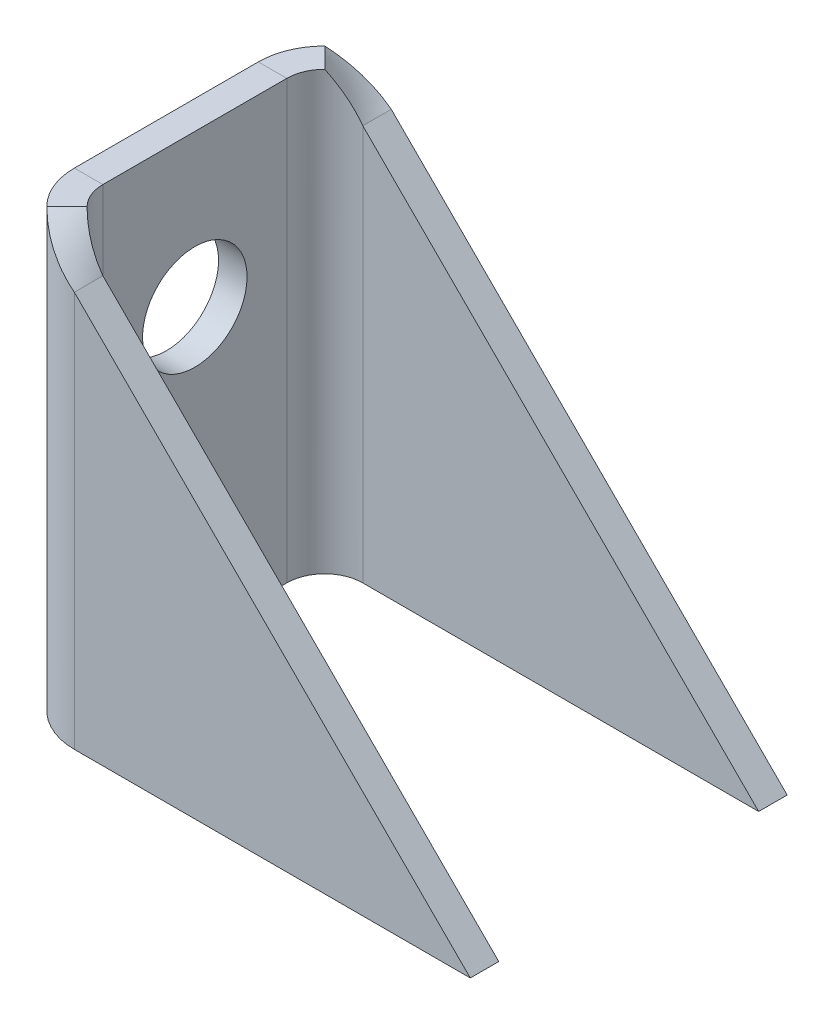
ISO-10303-21;
HEADER;
FILE_DESCRIPTION(('STEP AP214'),'2;1');
FILE_NAME('part.step','',(''),(''),'','','');
FILE_SCHEMA(('AUTOMOTIVE_DESIGN { 1 0 10303 214 1 1 1 1 }'));
ENDSEC;
DATA;
#1=APPLICATION_CONTEXT('core data for automotive mechanical design processes');
#2=APPLICATION_PROTOCOL_DEFINITION('international standard','automotive_design',2000,#1);
#3=PRODUCT_CONTEXT('',#1,'mechanical');
#4=PRODUCT('Part','Part','',(#3));
#5=PRODUCT_RELATED_PRODUCT_CATEGORY('part','',(#4));
#6=PRODUCT_DEFINITION_FORMATION('','',#4);
#7=PRODUCT_DEFINITION_CONTEXT('part definition',#1,'design');
#8=PRODUCT_DEFINITION('design','',#6,#7);
#9=PRODUCT_DEFINITION_SHAPE('','',#8);
#10=(LENGTH_UNIT() NAMED_UNIT(*) SI_UNIT(.MILLI.,.METRE.));
#11=(NAMED_UNIT(*) PLANE_ANGLE_UNIT() SI_UNIT($,.RADIAN.));
#12=(NAMED_UNIT(*) SI_UNIT($,.STERADIAN.) SOLID_ANGLE_UNIT());
#13=UNCERTAINTY_MEASURE_WITH_UNIT(LENGTH_MEASURE(1.E-05),#10,'distance_accuracy_value','');
#14=(GEOMETRIC_REPRESENTATION_CONTEXT(3) GLOBAL_UNCERTAINTY_ASSIGNED_CONTEXT((#13)) GLOBAL_UNIT_ASSIGNED_CONTEXT((#10,
#11,#12)) REPRESENTATION_CONTEXT('',''));
#15=CARTESIAN_POINT('',(0.,0.,0.));
#16=DIRECTION('',(0.,0.,1.));
#17=DIRECTION('',(1.,0.,0.));
#18=AXIS2_PLACEMENT_3D('',#15,#16,#17);
#19=CARTESIAN_POINT('',(37.1598449493429,23.,38.3401550506568));
#20=DIRECTION('',(0.,-1.,0.));
#21=DIRECTION('',(0.,0.,1.));
#22=AXIS2_PLACEMENT_3D('',#19,#20,#21);
#23=PLANE('',#22);
#24=DIRECTION('',(0.,0.,1.));
#25=VECTOR('',#24,1.);
#26=CARTESIAN_POINT('',(37.1598449493429,23.,38.3401550506568));
#27=LINE('',#26,#25);
#28=CARTESIAN_POINT('',(37.1598449493427,23.,3.50000000000001));
#29=VERTEX_POINT('',#28);
#30=CARTESIAN_POINT('',(37.1598449493428,23.,13.1803101013139));
#31=VERTEX_POINT('',#30);
#32=EDGE_CURVE('E61',#29,#31,#27,.T.);
#33=ORIENTED_EDGE('',*,*,#32,.F.);
#34=DIRECTION('',(-1.,0.,0.));
#35=VECTOR('',#34,1.);
#36=CARTESIAN_POINT('',(37.1598449493427,23.,3.50000000000001));
#37=LINE('',#36,#35);
#38=CARTESIAN_POINT('',(35.6598449493427,23.,3.50000000000002));
#39=VERTEX_POINT('',#38);
#40=EDGE_CURVE('E12',#29,#39,#37,.T.);
#41=ORIENTED_EDGE('',*,*,#40,.T.);
#42=DIRECTION('',(0.,0.,1.));
#43=VECTOR('',#42,1.);
#44=CARTESIAN_POINT('',(35.6598449493428,23.,38.3401550506568));
#45=LINE('',#44,#43);
#46=CARTESIAN_POINT('',(35.6598449493428,23.,13.1803101013139));
#47=VERTEX_POINT('',#46);
#48=EDGE_CURVE('E74',#39,#47,#45,.T.);
#49=ORIENTED_EDGE('',*,*,#48,.T.);
#50=DIRECTION('',(-1.,0.,0.));
#51=VECTOR('',#50,1.);
#52=CARTESIAN_POINT('',(37.1598449493428,23.,13.1803101013139));
#53=LINE('',#52,#51);
#54=EDGE_CURVE('E336',#31,#47,#53,.T.);
#55=ORIENTED_EDGE('',*,*,#54,.F.);
#56=EDGE_LOOP('',(#33,#41,#49,#55));
#57=FACE_BOUND('',#56,.T.);
#58=ADVANCED_FACE('F58',(#57),#23,.F.);
#59=CARTESIAN_POINT('',(37.1598449493429,0.,38.3401550506568));
#60=DIRECTION('',(0.,1.,0.));
#61=DIRECTION('',(0.,0.,-1.));
#62=AXIS2_PLACEMENT_3D('',#59,#60,#61);
#63=PLANE('',#62);
#64=DIRECTION('',(0.,0.,1.));
#65=VECTOR('',#64,1.);
#66=CARTESIAN_POINT('',(35.6598449493428,0.,38.3401550506568));
#67=LINE('',#66,#65);
#68=CARTESIAN_POINT('',(35.6598449493428,0.,13.1803101013139));
#69=VERTEX_POINT('',#68);
#70=CARTESIAN_POINT('',(35.6598449493427,0.,3.50000000000002));
#71=VERTEX_POINT('',#70);
#72=EDGE_CURVE('E81',#69,#71,#67,.F.);
#73=ORIENTED_EDGE('',*,*,#72,.T.);
#74=DIRECTION('',(1.,0.,0.));
#75=VECTOR('',#74,1.);
#76=CARTESIAN_POINT('',(37.1598449493427,0.,3.50000000000001));
#77=LINE('',#76,#75);
#78=CARTESIAN_POINT('',(37.1598449493427,0.,3.50000000000001));
#79=VERTEX_POINT('',#78);
#80=EDGE_CURVE('E310',#71,#79,#77,.T.);
#81=ORIENTED_EDGE('',*,*,#80,.T.);
#82=DIRECTION('',(0.,0.,-1.));
#83=VECTOR('',#82,1.);
#84=CARTESIAN_POINT('',(37.1598449493429,0.,38.3401550506568));
#85=LINE('',#84,#83);
#86=CARTESIAN_POINT('',(37.1598449493428,0.,13.1803101013139));
#87=VERTEX_POINT('',#86);
#88=EDGE_CURVE('E317',#87,#79,#85,.T.);
#89=ORIENTED_EDGE('',*,*,#88,.F.);
#90=DIRECTION('',(1.,0.,0.));
#91=VECTOR('',#90,1.);
#92=CARTESIAN_POINT('',(37.1598449493428,0.,13.1803101013139));
#93=LINE('',#92,#91);
#94=EDGE_CURVE('E311',#69,#87,#93,.T.);
#95=ORIENTED_EDGE('',*,*,#94,.F.);
#96=EDGE_LOOP('',(#73,#81,#89,#95));
#97=FACE_BOUND('',#96,.T.);
#98=ADVANCED_FACE('F477',(#97),#63,.F.);
#99=CARTESIAN_POINT('',(35.6598449493428,0.,38.3401550506568));
#100=DIRECTION('',(-1.,0.,0.));
#101=DIRECTION('',(0.,0.,1.));
#102=AXIS2_PLACEMENT_3D('',#99,#100,#101);
#103=PLANE('',#102);
#104=CARTESIAN_POINT('',(35.6598449493427,15.,8.34015505065677));
#105=DIRECTION('',(1.,0.,0.));
#106=DIRECTION('',(0.,0.,-1.));
#107=AXIS2_PLACEMENT_3D('',#104,#105,#106);
#108=CIRCLE('',#107,2.74999999999999);
#109=CARTESIAN_POINT('',(35.6598449493427,15.,5.59015505065678));
#110=VERTEX_POINT('',#109);
#111=EDGE_CURVE('E316',#110,#110,#108,.T.);
#112=ORIENTED_EDGE('',*,*,#111,.T.);
#113=EDGE_LOOP('',(#112));
#114=FACE_BOUND('',#113,.T.);
#115=ORIENTED_EDGE('',*,*,#48,.F.);
#116=DIRECTION('',(0.,-1.,0.));
#117=VECTOR('',#116,1.);
#118=CARTESIAN_POINT('',(35.6598449493427,0.,3.50000000000002));
#119=LINE('',#118,#117);
#120=EDGE_CURVE('E66',#39,#71,#119,.T.);
#121=ORIENTED_EDGE('',*,*,#120,.T.);
#122=ORIENTED_EDGE('',*,*,#72,.F.);
#123=DIRECTION('',(0.,-1.,0.));
#124=VECTOR('',#123,1.);
#125=CARTESIAN_POINT('',(35.6598449493428,0.,13.1803101013139));
#126=LINE('',#125,#124);
#127=EDGE_CURVE('E339',#47,#69,#126,.T.);
#128=ORIENTED_EDGE('',*,*,#127,.F.);
#129=EDGE_LOOP('',(#115,#121,#122,#128));
#130=FACE_BOUND('',#129,.T.);
#131=ADVANCED_FACE('F478',(#114,#130),#103,.T.);
#132=CARTESIAN_POINT('',(37.1598449493429,0.,38.3401550506568));
#133=DIRECTION('',(-1.,0.,0.));
#134=DIRECTION('',(0.,0.,1.));
#135=AXIS2_PLACEMENT_3D('',#132,#133,#134);
#136=PLANE('',#135);
#137=DIRECTION('',(0.,-1.,0.));
#138=VECTOR('',#137,1.);
#139=CARTESIAN_POINT('',(37.1598449493427,0.,3.50000000000001));
#140=LINE('',#139,#138);
#141=EDGE_CURVE('E308',#29,#79,#140,.T.);
#142=ORIENTED_EDGE('',*,*,#141,.F.);
#143=ORIENTED_EDGE('',*,*,#32,.T.);
#144=DIRECTION('',(0.,-1.,0.));
#145=VECTOR('',#144,1.);
#146=CARTESIAN_POINT('',(37.1598449493428,0.,13.1803101013139));
#147=LINE('',#146,#145);
#148=EDGE_CURVE('E321',#31,#87,#147,.T.);
#149=ORIENTED_EDGE('',*,*,#148,.T.);
#150=ORIENTED_EDGE('',*,*,#88,.T.);
#151=EDGE_LOOP('',(#142,#143,#149,#150));
#152=FACE_BOUND('',#151,.T.);
#153=CARTESIAN_POINT('',(37.1598449493427,15.,8.34015505065677));
#154=DIRECTION('',(1.,0.,0.));
#155=DIRECTION('',(0.,0.,-1.));
#156=AXIS2_PLACEMENT_3D('',#153,#154,#155);
#157=CIRCLE('',#156,2.74999999999999);
#158=CARTESIAN_POINT('',(37.1598449493427,15.,5.59015505065678));
#159=VERTEX_POINT('',#158);
#160=EDGE_CURVE('E315',#159,#159,#157,.T.);
#161=ORIENTED_EDGE('',*,*,#160,.F.);
#162=EDGE_LOOP('',(#161));
#163=FACE_BOUND('',#162,.T.);
#164=ADVANCED_FACE('F473',(#152,#163),#136,.F.);
#165=CARTESIAN_POINT('',(37.1598449493427,15.,8.34015505065677));
#166=DIRECTION('',(1.,0.,0.));
#167=DIRECTION('',(0.,0.,-1.));
#168=AXIS2_PLACEMENT_3D('',#165,#166,#167);
#169=CYLINDRICAL_SURFACE('',#168,2.74999999999999);
#170=ORIENTED_EDGE('',*,*,#160,.T.);
#171=EDGE_LOOP('',(#170));
#172=FACE_BOUND('',#171,.T.);
#173=ORIENTED_EDGE('',*,*,#111,.F.);
#174=EDGE_LOOP('',(#173));
#175=FACE_BOUND('',#174,.T.);
#176=ADVANCED_FACE('F431',(#172,#175),#169,.F.);
#177=CARTESIAN_POINT('',(36.6849712151899,23.,15.6551838354668));
#178=CARTESIAN_POINT('',(37.0089675436019,22.6399857128719,15.9791801638789));
#179=CARTESIAN_POINT('',(37.3971785180446,22.2800516835523,16.2385624605538));
#180=CARTESIAN_POINT('',(38.2437273540853,21.5601033671047,16.589214469653));
#181=CARTESIAN_POINT('',(38.7016449475433,21.2001693377851,16.6803101013139));
#182=CARTESIAN_POINT('',(39.1598449493428,20.840155050657,16.6803101013139));
#183=CARTESIAN_POINT('',(37.7456313869697,23.,14.594523663687));
#184=CARTESIAN_POINT('',(37.9307630559111,22.6400033890676,14.7796553326284));
#185=CARTESIAN_POINT('',(38.152606988601,22.2800516835523,14.9278828780224));
#186=CARTESIAN_POINT('',(38.6363491806242,21.5601033671047,15.1282554546505));
#187=CARTESIAN_POINT('',(38.8980292323011,21.2001516615893,15.1803101013139));
#188=CARTESIAN_POINT('',(39.1598449493428,20.840155050657,15.1803101013139));
#189=B_SPLINE_SURFACE_WITH_KNOTS('',1,3,((#177,#178,#179,#180,#181,#182),(#183,#184,#185,#186,
#187,#188)),.UNSPECIFIED.,.F.,.F.,.F.,(2,2),(4,2,4),(0.,1.),(0.,0.5,1.),.UNSPECIFIED.);
#190=CARTESIAN_POINT('',(37.7456313869697,23.,14.594523663687));
#191=CARTESIAN_POINT('',(36.6849712151899,23.,15.6551838354668));
#192=B_SPLINE_CURVE_WITH_KNOTS('',1,(#190,#191),.UNSPECIFIED.,.F.,.F.,(2,2),(0.,1.),.UNSPECIFIED.);
#193=CARTESIAN_POINT('',(36.6849712151899,23.,15.6551838354668));
#194=VERTEX_POINT('',#193);
#195=CARTESIAN_POINT('',(37.7456313869697,23.,14.594523663687));
#196=VERTEX_POINT('',#195);
#197=EDGE_CURVE('E334',#194,#196,#192,.F.);
#198=CARTESIAN_POINT('',(36.6849712151899,23.,15.6551838354668));
#199=CARTESIAN_POINT('',(37.0089675436019,22.6399857128719,15.9791801638789));
#200=CARTESIAN_POINT('',(37.3971785180446,22.2800516835523,16.2385624605538));
#201=CARTESIAN_POINT('',(38.2437273540853,21.5601033671047,16.589214469653));
#202=CARTESIAN_POINT('',(38.7016449475433,21.2001693377851,16.6803101013139));
#203=CARTESIAN_POINT('',(39.1598449493428,20.840155050657,16.6803101013139));
#204=B_SPLINE_CURVE_WITH_KNOTS('',3,(#198,#199,#200,#201,#202,#203),.UNSPECIFIED.,.F.,.F.,(4,2,
4),(0.,0.5,1.),.UNSPECIFIED.);
#205=CARTESIAN_POINT('',(39.1598449493428,20.840155050657,16.6803101013139));
#206=VERTEX_POINT('',#205);
#207=EDGE_CURVE('E371',#194,#206,#204,.T.);
#208=CARTESIAN_POINT('',(39.1598449493428,20.840155050657,16.6803101013139));
#209=CARTESIAN_POINT('',(39.1598449493428,20.840155050657,15.1803101013139));
#210=B_SPLINE_CURVE_WITH_KNOTS('',1,(#208,#209),.UNSPECIFIED.,.F.,.F.,(2,2),(0.,1.),.UNSPECIFIED.);
#211=CARTESIAN_POINT('',(39.1598449493428,20.840155050657,15.1803101013139));
#212=VERTEX_POINT('',#211);
#213=EDGE_CURVE('E352',#212,#206,#210,.F.);
#214=CARTESIAN_POINT('',(39.1598449493428,20.840155050657,15.1803101013139));
#215=CARTESIAN_POINT('',(38.8980292323011,21.2001516615893,15.1803101013139));
#216=CARTESIAN_POINT('',(38.6363491806242,21.5601033671047,15.1282554546505));
#217=CARTESIAN_POINT('',(38.152606988601,22.2800516835523,14.9278828780224));
#218=CARTESIAN_POINT('',(37.9307630559111,22.6400033890676,14.7796553326284));
#219=CARTESIAN_POINT('',(37.7456313869697,23.,14.594523663687));
#220=B_SPLINE_CURVE_WITH_KNOTS('',3,(#214,#215,#216,#217,#218,#219),.UNSPECIFIED.,.F.,.F.,(4,2,
4),(0.,0.5,1.),.UNSPECIFIED.);
#221=EDGE_CURVE('E366',#196,#212,#220,.F.);
#222=ORIENTED_EDGE('',*,*,#197,.F.);
#223=ORIENTED_EDGE('',*,*,#207,.T.);
#224=ORIENTED_EDGE('',*,*,#213,.F.);
#225=ORIENTED_EDGE('',*,*,#221,.F.);
#226=EDGE_LOOP('',(#222,#223,#224,#225));
#227=FACE_BOUND('',#226,.T.);
#228=ADVANCED_FACE('F420',(#227),#189,.F.);
#229=CARTESIAN_POINT('',(39.1598449493428,0.,13.1803101013139));
#230=DIRECTION('',(0.,1.,0.));
#231=DIRECTION('',(0.,0.,1.));
#232=AXIS2_PLACEMENT_3D('',#229,#230,#231);
#233=PLANE('',#232);
#234=DIRECTION('',(0.,0.,-1.));
#235=VECTOR('',#234,1.);
#236=CARTESIAN_POINT('',(39.1598449493428,0.,15.1803101013139));
#237=LINE('',#236,#235);
#238=CARTESIAN_POINT('',(39.1598449493428,0.,16.6803101013139));
#239=VERTEX_POINT('',#238);
#240=CARTESIAN_POINT('',(39.1598449493428,0.,15.1803101013138));
#241=VERTEX_POINT('',#240);
#242=EDGE_CURVE('E467',#239,#241,#237,.T.);
#243=ORIENTED_EDGE('',*,*,#242,.F.);
#244=CARTESIAN_POINT('',(39.1598449493428,0.,13.1803101013139));
#245=DIRECTION('',(0.,-1.,0.));
#246=DIRECTION('',(0.,0.,-1.));
#247=AXIS2_PLACEMENT_3D('',#244,#245,#246);
#248=CIRCLE('',#247,3.5);
#249=EDGE_CURVE('E367',#239,#69,#248,.T.);
#250=ORIENTED_EDGE('',*,*,#249,.T.);
#251=ORIENTED_EDGE('',*,*,#94,.T.);
#252=CARTESIAN_POINT('',(39.1598449493428,0.,13.1803101013139));
#253=DIRECTION('',(0.,-1.,0.));
#254=DIRECTION('',(0.,0.,-1.));
#255=AXIS2_PLACEMENT_3D('',#252,#253,#254);
#256=CIRCLE('',#255,2.);
#257=EDGE_CURVE('E362',#241,#87,#256,.T.);
#258=ORIENTED_EDGE('',*,*,#257,.F.);
#259=EDGE_LOOP('',(#243,#250,#251,#258));
#260=FACE_BOUND('',#259,.T.);
#261=ADVANCED_FACE('F394',(#260),#233,.F.);
#262=CARTESIAN_POINT('',(39.1598449493428,23.,13.1803101013139));
#263=DIRECTION('',(0.,-1.,0.));
#264=DIRECTION('',(-1.,0.,0.));
#265=AXIS2_PLACEMENT_3D('',#262,#263,#264);
#266=PLANE('',#265);
#267=CARTESIAN_POINT('',(39.1598449493428,23.,13.1803101013139));
#268=DIRECTION('',(0.,-1.,0.));
#269=DIRECTION('',(0.,0.,-1.));
#270=AXIS2_PLACEMENT_3D('',#267,#268,#269);
#271=CIRCLE('',#270,3.5);
#272=EDGE_CURVE('E370',#47,#194,#271,.F.);
#273=ORIENTED_EDGE('',*,*,#272,.T.);
#274=ORIENTED_EDGE('',*,*,#197,.T.);
#275=CARTESIAN_POINT('',(39.1598449493428,23.,13.1803101013139));
#276=DIRECTION('',(0.,1.,0.));
#277=DIRECTION('',(1.,0.,0.));
#278=AXIS2_PLACEMENT_3D('',#275,#276,#277);
#279=CIRCLE('',#278,2.);
#280=EDGE_CURVE('E365',#31,#196,#279,.T.);
#281=ORIENTED_EDGE('',*,*,#280,.F.);
#282=ORIENTED_EDGE('',*,*,#54,.T.);
#283=EDGE_LOOP('',(#273,#274,#281,#282));
#284=FACE_BOUND('',#283,.T.);
#285=ADVANCED_FACE('F387',(#284),#266,.F.);
#286=CARTESIAN_POINT('',(39.1598449493428,34.9501539615587,13.1803101013139));
#287=DIRECTION('',(0.,-1.,0.));
#288=DIRECTION('',(0.,0.,-1.));
#289=AXIS2_PLACEMENT_3D('',#286,#287,#288);
#290=CYLINDRICAL_SURFACE('',#289,2.);
#291=ORIENTED_EDGE('',*,*,#148,.F.);
#292=ORIENTED_EDGE('',*,*,#280,.T.);
#293=ORIENTED_EDGE('',*,*,#221,.T.);
#294=DIRECTION('',(0.,-1.,0.));
#295=VECTOR('',#294,1.);
#296=CARTESIAN_POINT('',(39.1598449493428,0.,15.1803101013139));
#297=LINE('',#296,#295);
#298=EDGE_CURVE('E344',#212,#241,#297,.T.);
#299=ORIENTED_EDGE('',*,*,#298,.T.);
#300=ORIENTED_EDGE('',*,*,#257,.T.);
#301=EDGE_LOOP('',(#291,#292,#293,#299,#300));
#302=FACE_BOUND('',#301,.T.);
#303=ADVANCED_FACE('F378',(#302),#290,.F.);
#304=CARTESIAN_POINT('',(39.1598449493428,34.9501539615587,13.1803101013139));
#305=DIRECTION('',(0.,-1.,0.));
#306=DIRECTION('',(0.,0.,-1.));
#307=AXIS2_PLACEMENT_3D('',#304,#305,#306);
#308=CYLINDRICAL_SURFACE('',#307,3.5);
#309=ORIENTED_EDGE('',*,*,#127,.T.);
#310=ORIENTED_EDGE('',*,*,#249,.F.);
#311=DIRECTION('',(0.,-1.,0.));
#312=VECTOR('',#311,1.);
#313=CARTESIAN_POINT('',(39.1598449493428,0.,16.6803101013139));
#314=LINE('',#313,#312);
#315=EDGE_CURVE('E292',#206,#239,#314,.T.);
#316=ORIENTED_EDGE('',*,*,#315,.F.);
#317=ORIENTED_EDGE('',*,*,#207,.F.);
#318=ORIENTED_EDGE('',*,*,#272,.F.);
#319=EDGE_LOOP('',(#309,#310,#316,#317,#318));
#320=FACE_BOUND('',#319,.T.);
#321=ADVANCED_FACE('F277',(#320),#308,.T.);
#322=CARTESIAN_POINT('',(59.9999999999997,0.,15.1803101013137));
#323=DIRECTION('',(0.,0.,1.));
#324=DIRECTION('',(1.,0.,0.));
#325=AXIS2_PLACEMENT_3D('',#322,#323,#324);
#326=PLANE('',#325);
#327=ORIENTED_EDGE('',*,*,#298,.F.);
#328=DIRECTION('',(-0.707106781186546,0.707106781186549,0.));
#329=VECTOR('',#328,1.);
#330=CARTESIAN_POINT('',(59.9999999999997,0.,15.1803101013137));
#331=LINE('',#330,#329);
#332=CARTESIAN_POINT('',(59.9999999999997,0.,15.1803101013137));
#333=VERTEX_POINT('',#332);
#334=EDGE_CURVE('E350',#333,#212,#331,.T.);
#335=ORIENTED_EDGE('',*,*,#334,.F.);
#336=DIRECTION('',(-1.,0.,0.));
#337=VECTOR('',#336,1.);
#338=CARTESIAN_POINT('',(59.9999999999997,0.,15.1803101013137));
#339=LINE('',#338,#337);
#340=EDGE_CURVE('E347',#333,#241,#339,.T.);
#341=ORIENTED_EDGE('',*,*,#340,.T.);
#342=EDGE_LOOP('',(#327,#335,#341));
#343=FACE_BOUND('',#342,.T.);
#344=ADVANCED_FACE('F273',(#343),#326,.F.);
#345=CARTESIAN_POINT('',(59.9999999999997,0.,15.1803101013137));
#346=DIRECTION('',(0.707106781186549,0.707106781186546,0.));
#347=DIRECTION('',(-0.707106781186546,0.707106781186549,0.));
#348=AXIS2_PLACEMENT_3D('',#345,#346,#347);
#349=PLANE('',#348);
#350=ORIENTED_EDGE('',*,*,#334,.T.);
#351=ORIENTED_EDGE('',*,*,#213,.T.);
#352=DIRECTION('',(-0.707106781186546,0.707106781186549,0.));
#353=VECTOR('',#352,1.);
#354=CARTESIAN_POINT('',(59.9999999999997,0.,16.6803101013137));
#355=LINE('',#354,#353);
#356=CARTESIAN_POINT('',(59.9999999999997,0.,16.6803101013137));
#357=VERTEX_POINT('',#356);
#358=EDGE_CURVE('E301',#357,#206,#355,.T.);
#359=ORIENTED_EDGE('',*,*,#358,.F.);
#360=DIRECTION('',(0.,0.,-1.));
#361=VECTOR('',#360,1.);
#362=CARTESIAN_POINT('',(59.9999999999997,0.,15.1803101013137));
#363=LINE('',#362,#361);
#364=EDGE_CURVE('E305',#357,#333,#363,.T.);
#365=ORIENTED_EDGE('',*,*,#364,.T.);
#366=EDGE_LOOP('',(#350,#351,#359,#365));
#367=FACE_BOUND('',#366,.T.);
#368=ADVANCED_FACE('F276',(#367),#349,.T.);
#369=CARTESIAN_POINT('',(59.9999999999997,0.,16.6803101013137));
#370=DIRECTION('',(0.,0.,1.));
#371=DIRECTION('',(1.,0.,0.));
#372=AXIS2_PLACEMENT_3D('',#369,#370,#371);
#373=PLANE('',#372);
#374=ORIENTED_EDGE('',*,*,#358,.T.);
#375=ORIENTED_EDGE('',*,*,#315,.T.);
#376=DIRECTION('',(1.,0.,0.));
#377=VECTOR('',#376,1.);
#378=CARTESIAN_POINT('',(59.9999999999997,0.,16.6803101013137));
#379=LINE('',#378,#377);
#380=EDGE_CURVE('E300',#357,#239,#379,.F.);
#381=ORIENTED_EDGE('',*,*,#380,.F.);
#382=EDGE_LOOP('',(#374,#375,#381));
#383=FACE_BOUND('',#382,.T.);
#384=ADVANCED_FACE('F282',(#383),#373,.T.);
#385=CARTESIAN_POINT('',(59.9999999999997,0.,15.1803101013137));
#386=DIRECTION('',(0.,1.,0.));
#387=DIRECTION('',(-1.,0.,0.));
#388=AXIS2_PLACEMENT_3D('',#385,#386,#387);
#389=PLANE('',#388);
#390=ORIENTED_EDGE('',*,*,#380,.T.);
#391=ORIENTED_EDGE('',*,*,#242,.T.);
#392=ORIENTED_EDGE('',*,*,#340,.F.);
#393=ORIENTED_EDGE('',*,*,#364,.F.);
#394=EDGE_LOOP('',(#390,#391,#392,#393));
#395=FACE_BOUND('',#394,.T.);
#396=ADVANCED_FACE('F389',(#395),#389,.F.);
#397=CARTESIAN_POINT('',(0.,0.,1.5));
#398=DIRECTION('',(0.,0.,-1.));
#399=DIRECTION('',(-1.,0.,0.));
#400=AXIS2_PLACEMENT_3D('',#397,#398,#399);
#401=PLANE('',#400);
#402=DIRECTION('',(0.707106781186552,-0.707106781186544,0.));
#403=VECTOR('',#402,1.);
#404=CARTESIAN_POINT('',(60.,0.,1.5));
#405=LINE('',#404,#403);
#406=CARTESIAN_POINT('',(39.1598449493427,20.840155050657,1.5));
#407=VERTEX_POINT('',#406);
#408=CARTESIAN_POINT('',(60.,0.,1.5));
#409=VERTEX_POINT('',#408);
#410=EDGE_CURVE('E249',#407,#409,#405,.T.);
#411=ORIENTED_EDGE('',*,*,#410,.F.);
#412=DIRECTION('',(0.,-1.,0.));
#413=VECTOR('',#412,1.);
#414=CARTESIAN_POINT('',(39.1598449493427,0.,1.5));
#415=LINE('',#414,#413);
#416=CARTESIAN_POINT('',(39.1598449493427,0.,1.5));
#417=VERTEX_POINT('',#416);
#418=EDGE_CURVE('E178',#407,#417,#415,.T.);
#419=ORIENTED_EDGE('',*,*,#418,.T.);
#420=DIRECTION('',(1.,0.,0.));
#421=VECTOR('',#420,1.);
#422=CARTESIAN_POINT('',(0.,0.,1.5));
#423=LINE('',#422,#421);
#424=EDGE_CURVE('E241',#417,#409,#423,.T.);
#425=ORIENTED_EDGE('',*,*,#424,.T.);
#426=EDGE_LOOP('',(#411,#419,#425));
#427=FACE_BOUND('',#426,.T.);
#428=ADVANCED_FACE('F499',(#427),#401,.F.);
#429=CARTESIAN_POINT('',(0.,0.,1.5));
#430=DIRECTION('',(0.,1.,0.));
#431=DIRECTION('',(1.,0.,0.));
#432=AXIS2_PLACEMENT_3D('',#429,#430,#431);
#433=PLANE('',#432);
#434=DIRECTION('',(0.,0.,1.));
#435=VECTOR('',#434,1.);
#436=CARTESIAN_POINT('',(39.1598449493427,0.,1.5));
#437=LINE('',#436,#435);
#438=CARTESIAN_POINT('',(39.1598449493427,0.,0.));
#439=VERTEX_POINT('',#438);
#440=EDGE_CURVE('E244',#439,#417,#437,.T.);
#441=ORIENTED_EDGE('',*,*,#440,.F.);
#442=DIRECTION('',(-1.,0.,0.));
#443=VECTOR('',#442,1.);
#444=CARTESIAN_POINT('',(0.,0.,0.));
#445=LINE('',#444,#443);
#446=CARTESIAN_POINT('',(60.,0.,0.));
#447=VERTEX_POINT('',#446);
#448=EDGE_CURVE('E238',#439,#447,#445,.F.);
#449=ORIENTED_EDGE('',*,*,#448,.T.);
#450=DIRECTION('',(0.,0.,1.));
#451=VECTOR('',#450,1.);
#452=CARTESIAN_POINT('',(60.,0.,1.5));
#453=LINE('',#452,#451);
#454=EDGE_CURVE('E229',#447,#409,#453,.T.);
#455=ORIENTED_EDGE('',*,*,#454,.T.);
#456=ORIENTED_EDGE('',*,*,#424,.F.);
#457=EDGE_LOOP('',(#441,#449,#455,#456));
#458=FACE_BOUND('',#457,.T.);
#459=ADVANCED_FACE('F497',(#458),#433,.F.);
#460=CARTESIAN_POINT('',(0.,0.,0.));
#461=DIRECTION('',(0.,0.,-1.));
#462=DIRECTION('',(-1.,0.,0.));
#463=AXIS2_PLACEMENT_3D('',#460,#461,#462);
#464=PLANE('',#463);
#465=DIRECTION('',(0.,-1.,0.));
#466=VECTOR('',#465,1.);
#467=CARTESIAN_POINT('',(39.1598449493427,0.,0.));
#468=LINE('',#467,#466);
#469=CARTESIAN_POINT('',(39.1598449493427,20.840155050657,0.));
#470=VERTEX_POINT('',#469);
#471=EDGE_CURVE('E247',#470,#439,#468,.T.);
#472=ORIENTED_EDGE('',*,*,#471,.F.);
#473=DIRECTION('',(0.707106781186552,-0.707106781186544,0.));
#474=VECTOR('',#473,1.);
#475=CARTESIAN_POINT('',(60.,0.,0.));
#476=LINE('',#475,#474);
#477=EDGE_CURVE('E237',#470,#447,#476,.T.);
#478=ORIENTED_EDGE('',*,*,#477,.T.);
#479=ORIENTED_EDGE('',*,*,#448,.F.);
#480=EDGE_LOOP('',(#472,#478,#479));
#481=FACE_BOUND('',#480,.T.);
#482=ADVANCED_FACE('F271',(#481),#464,.T.);
#483=CARTESIAN_POINT('',(60.,0.,1.5));
#484=DIRECTION('',(0.707106781186544,0.707106781186551,0.));
#485=DIRECTION('',(0.707106781186552,-0.707106781186544,0.));
#486=AXIS2_PLACEMENT_3D('',#483,#484,#485);
#487=PLANE('',#486);
#488=CARTESIAN_POINT('',(39.1598449493427,20.840155050657,1.5));
#489=CARTESIAN_POINT('',(39.1598449493427,20.840155050657,0.));
#490=B_SPLINE_CURVE_WITH_KNOTS('',1,(#488,#489),.UNSPECIFIED.,.F.,.F.,(2,2),(0.,1.),.UNSPECIFIED.);
#491=EDGE_CURVE('E162',#407,#470,#490,.T.);
#492=ORIENTED_EDGE('',*,*,#491,.F.);
#493=ORIENTED_EDGE('',*,*,#410,.T.);
#494=ORIENTED_EDGE('',*,*,#454,.F.);
#495=ORIENTED_EDGE('',*,*,#477,.F.);
#496=EDGE_LOOP('',(#492,#493,#494,#495));
#497=FACE_BOUND('',#496,.T.);
#498=ADVANCED_FACE('F210',(#497),#487,.T.);
#499=CARTESIAN_POINT('',(39.1598449493427,23.,3.5));
#500=DIRECTION('',(0.,-1.,0.));
#501=DIRECTION('',(0.,0.,-1.));
#502=AXIS2_PLACEMENT_3D('',#499,#500,#501);
#503=PLANE('',#502);
#504=CARTESIAN_POINT('',(36.6849712151898,23.,1.02512626584709));
#505=CARTESIAN_POINT('',(37.7456313869696,23.,2.08578643762691));
#506=B_SPLINE_CURVE_WITH_KNOTS('',1,(#504,#505),.UNSPECIFIED.,.F.,.F.,(2,2),(0.,1.),.UNSPECIFIED.);
#507=CARTESIAN_POINT('',(36.6849712151898,23.,1.02512626584709));
#508=VERTEX_POINT('',#507);
#509=CARTESIAN_POINT('',(37.7456313869696,23.,2.08578643762691));
#510=VERTEX_POINT('',#509);
#511=EDGE_CURVE('E147',#508,#510,#506,.T.);
#512=ORIENTED_EDGE('',*,*,#511,.F.);
#513=CARTESIAN_POINT('',(39.1598449493427,23.,3.5));
#514=DIRECTION('',(0.,-1.,0.));
#515=DIRECTION('',(0.,0.,-1.));
#516=AXIS2_PLACEMENT_3D('',#513,#514,#515);
#517=CIRCLE('',#516,3.5);
#518=EDGE_CURVE('E486',#508,#39,#517,.F.);
#519=ORIENTED_EDGE('',*,*,#518,.T.);
#520=ORIENTED_EDGE('',*,*,#40,.F.);
#521=CARTESIAN_POINT('',(39.1598449493427,23.,3.5));
#522=DIRECTION('',(0.,1.,0.));
#523=DIRECTION('',(0.,0.,1.));
#524=AXIS2_PLACEMENT_3D('',#521,#522,#523);
#525=CIRCLE('',#524,2.);
#526=EDGE_CURVE('E167',#510,#29,#525,.T.);
#527=ORIENTED_EDGE('',*,*,#526,.F.);
#528=EDGE_LOOP('',(#512,#519,#520,#527));
#529=FACE_BOUND('',#528,.T.);
#530=ADVANCED_FACE('F168',(#529),#503,.F.);
#531=CARTESIAN_POINT('',(39.1598449493427,0.,3.5));
#532=DIRECTION('',(0.,1.,0.));
#533=DIRECTION('',(0.,0.,1.));
#534=AXIS2_PLACEMENT_3D('',#531,#532,#533);
#535=PLANE('',#534);
#536=ORIENTED_EDGE('',*,*,#80,.F.);
#537=CARTESIAN_POINT('',(39.1598449493427,0.,3.5));
#538=DIRECTION('',(0.,-1.,0.));
#539=DIRECTION('',(0.,0.,-1.));
#540=AXIS2_PLACEMENT_3D('',#537,#538,#539);
#541=CIRCLE('',#540,3.5);
#542=EDGE_CURVE('E484',#71,#439,#541,.T.);
#543=ORIENTED_EDGE('',*,*,#542,.T.);
#544=ORIENTED_EDGE('',*,*,#440,.T.);
#545=CARTESIAN_POINT('',(39.1598449493427,0.,3.5));
#546=DIRECTION('',(0.,-1.,0.));
#547=DIRECTION('',(0.,0.,-1.));
#548=AXIS2_PLACEMENT_3D('',#545,#546,#547);
#549=CIRCLE('',#548,2.);
#550=EDGE_CURVE('E171',#79,#417,#549,.T.);
#551=ORIENTED_EDGE('',*,*,#550,.F.);
#552=EDGE_LOOP('',(#536,#543,#544,#551));
#553=FACE_BOUND('',#552,.T.);
#554=ADVANCED_FACE('F203',(#553),#535,.F.);
#555=CARTESIAN_POINT('',(39.1598449493427,20.840155050657,0.));
#556=CARTESIAN_POINT('',(38.7016449475433,21.2001693377852,0.));
#557=CARTESIAN_POINT('',(38.2437273540852,21.5601033671047,0.0910956316608954));
#558=CARTESIAN_POINT('',(37.3971785180446,22.2800516835523,0.441747640760098));
#559=CARTESIAN_POINT('',(37.0089675436019,22.6399857128719,0.701129937435013));
#560=CARTESIAN_POINT('',(36.6849712151898,23.,1.02512626584709));
#561=CARTESIAN_POINT('',(39.1598449493427,20.840155050657,1.5));
#562=CARTESIAN_POINT('',(38.898029232301,21.2001516615894,1.5));
#563=CARTESIAN_POINT('',(38.6363491806242,21.5601033671047,1.55205464666337));
#564=CARTESIAN_POINT('',(38.1526069886009,22.2800516835523,1.75242722329149));
#565=CARTESIAN_POINT('',(37.930763055911,22.6400033890677,1.9006547686855));
#566=CARTESIAN_POINT('',(37.7456313869696,23.,2.08578643762691));
#567=B_SPLINE_SURFACE_WITH_KNOTS('',1,3,((#555,#556,#557,#558,#559,#560),(#561,#562,#563,#564,
#565,#566)),.UNSPECIFIED.,.F.,.F.,.F.,(2,2),(4,2,4),(0.,1.),(0.,0.5,1.),.UNSPECIFIED.);
#568=CARTESIAN_POINT('',(39.1598449493427,20.840155050657,0.));
#569=CARTESIAN_POINT('',(38.7016449475433,21.2001693377852,0.));
#570=CARTESIAN_POINT('',(38.2437273540852,21.5601033671047,0.0910956316608954));
#571=CARTESIAN_POINT('',(37.3971785180446,22.2800516835523,0.441747640760098));
#572=CARTESIAN_POINT('',(37.0089675436019,22.6399857128719,0.701129937435013));
#573=CARTESIAN_POINT('',(36.6849712151898,23.,1.02512626584709));
#574=B_SPLINE_CURVE_WITH_KNOTS('',3,(#568,#569,#570,#571,#572,#573),.UNSPECIFIED.,.F.,.F.,(4,2,
4),(0.,0.5,1.),.UNSPECIFIED.);
#575=EDGE_CURVE('E156',#470,#508,#574,.T.);
#576=CARTESIAN_POINT('',(37.7456313869696,23.,2.08578643762691));
#577=CARTESIAN_POINT('',(37.930763055911,22.6400033890677,1.9006547686855));
#578=CARTESIAN_POINT('',(38.1526069886009,22.2800516835523,1.75242722329149));
#579=CARTESIAN_POINT('',(38.6363491806242,21.5601033671047,1.55205464666337));
#580=CARTESIAN_POINT('',(38.898029232301,21.2001516615894,1.5));
#581=CARTESIAN_POINT('',(39.1598449493427,20.840155050657,1.5));
#582=B_SPLINE_CURVE_WITH_KNOTS('',3,(#576,#577,#578,#579,#580,#581),.UNSPECIFIED.,.F.,.F.,(4,2,
4),(0.,0.5,1.),.UNSPECIFIED.);
#583=EDGE_CURVE('E153',#407,#510,#582,.F.);
#584=ORIENTED_EDGE('',*,*,#575,.T.);
#585=ORIENTED_EDGE('',*,*,#511,.T.);
#586=ORIENTED_EDGE('',*,*,#583,.F.);
#587=ORIENTED_EDGE('',*,*,#491,.T.);
#588=EDGE_LOOP('',(#584,#585,#586,#587));
#589=FACE_BOUND('',#588,.T.);
#590=ADVANCED_FACE('F150',(#589),#567,.F.);
#591=CARTESIAN_POINT('',(39.1598449493427,33.8702314868873,3.5));
#592=DIRECTION('',(0.,-1.,0.));
#593=DIRECTION('',(0.,0.,-1.));
#594=AXIS2_PLACEMENT_3D('',#591,#592,#593);
#595=CYLINDRICAL_SURFACE('',#594,2.);
#596=ORIENTED_EDGE('',*,*,#418,.F.);
#597=ORIENTED_EDGE('',*,*,#583,.T.);
#598=ORIENTED_EDGE('',*,*,#526,.T.);
#599=ORIENTED_EDGE('',*,*,#141,.T.);
#600=ORIENTED_EDGE('',*,*,#550,.T.);
#601=EDGE_LOOP('',(#596,#597,#598,#599,#600));
#602=FACE_BOUND('',#601,.T.);
#603=ADVANCED_FACE('F175',(#602),#595,.F.);
#604=CARTESIAN_POINT('',(39.1598449493427,33.8702314868873,3.5));
#605=DIRECTION('',(0.,-1.,0.));
#606=DIRECTION('',(0.,0.,-1.));
#607=AXIS2_PLACEMENT_3D('',#604,#605,#606);
#608=CYLINDRICAL_SURFACE('',#607,3.5);
#609=ORIENTED_EDGE('',*,*,#471,.T.);
#610=ORIENTED_EDGE('',*,*,#542,.F.);
#611=ORIENTED_EDGE('',*,*,#120,.F.);
#612=ORIENTED_EDGE('',*,*,#518,.F.);
#613=ORIENTED_EDGE('',*,*,#575,.F.);
#614=EDGE_LOOP('',(#609,#610,#611,#612,#613));
#615=FACE_BOUND('',#614,.T.);
#616=ADVANCED_FACE('F193',(#615),#608,.T.);
#617=CLOSED_SHELL('',(#58,#98,#131,#164,#176,#228,#261,#285,#303,#321,#344,#368,#384,#396,#428,
#459,#482,#498,#530,#554,#590,#603,#616));
#618=MANIFOLD_SOLID_BREP('B2',#617);
#619=ADVANCED_BREP_SHAPE_REPRESENTATION('',(#18,#618),#14);
#620=SHAPE_DEFINITION_REPRESENTATION(#9,#619);
ENDSEC;
END-ISO-10303-21;
